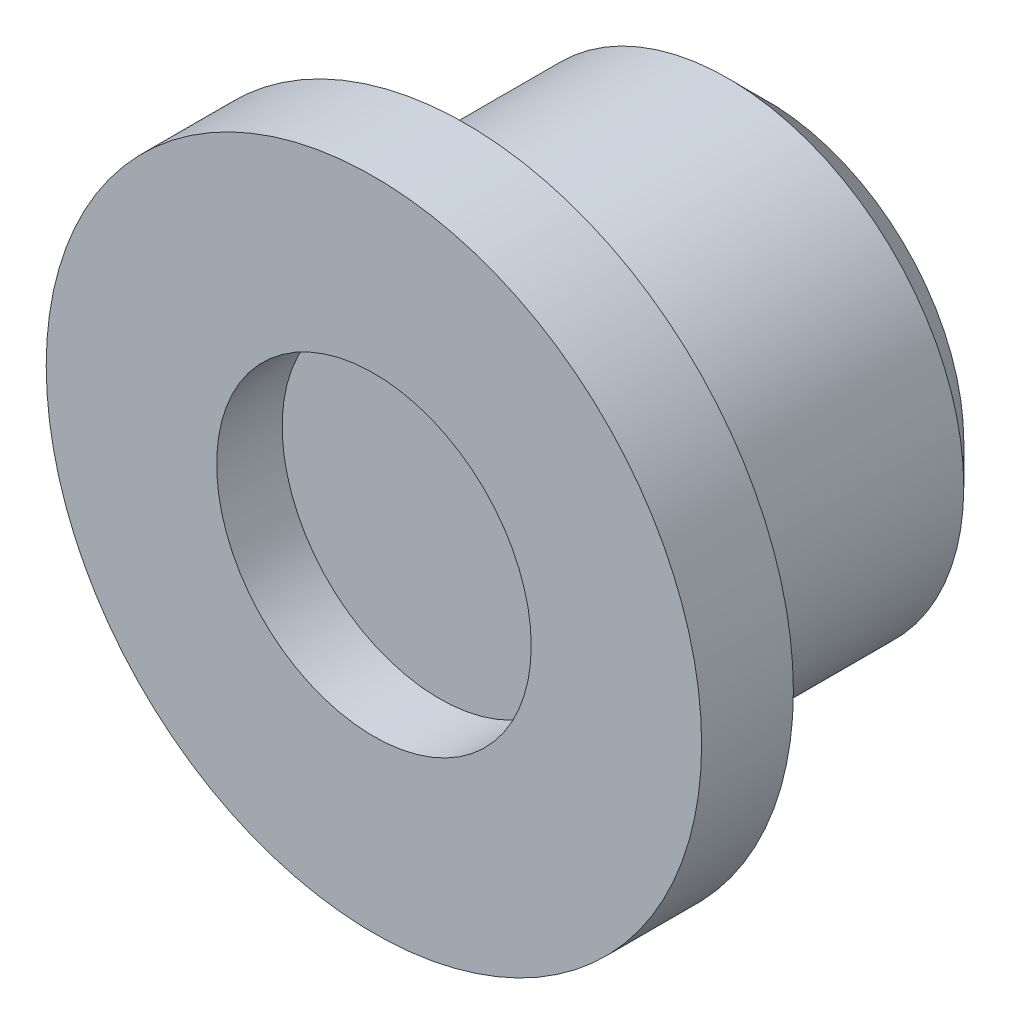
ISO-10303-21;
HEADER;
FILE_DESCRIPTION(('STEP AP214'),'2;1');
FILE_NAME('part.step','',(''),(''),'','','');
FILE_SCHEMA(('AUTOMOTIVE_DESIGN { 1 0 10303 214 1 1 1 1 }'));
ENDSEC;
DATA;
#1=APPLICATION_CONTEXT('core data for automotive mechanical design processes');
#2=APPLICATION_PROTOCOL_DEFINITION('international standard','automotive_design',2000,#1);
#3=PRODUCT_CONTEXT('',#1,'mechanical');
#4=PRODUCT('Part','Part','',(#3));
#5=PRODUCT_RELATED_PRODUCT_CATEGORY('part','',(#4));
#6=PRODUCT_DEFINITION_FORMATION('','',#4);
#7=PRODUCT_DEFINITION_CONTEXT('part definition',#1,'design');
#8=PRODUCT_DEFINITION('design','',#6,#7);
#9=PRODUCT_DEFINITION_SHAPE('','',#8);
#10=(LENGTH_UNIT() NAMED_UNIT(*) SI_UNIT(.MILLI.,.METRE.));
#11=(NAMED_UNIT(*) PLANE_ANGLE_UNIT() SI_UNIT($,.RADIAN.));
#12=(NAMED_UNIT(*) SI_UNIT($,.STERADIAN.) SOLID_ANGLE_UNIT());
#13=UNCERTAINTY_MEASURE_WITH_UNIT(LENGTH_MEASURE(1.E-05),#10,'distance_accuracy_value','');
#14=(GEOMETRIC_REPRESENTATION_CONTEXT(3) GLOBAL_UNCERTAINTY_ASSIGNED_CONTEXT((#13)) GLOBAL_UNIT_ASSIGNED_CONTEXT((#10,
#11,#12)) REPRESENTATION_CONTEXT('',''));
#15=CARTESIAN_POINT('',(0.,0.,0.));
#16=DIRECTION('',(0.,0.,1.));
#17=DIRECTION('',(1.,0.,0.));
#18=AXIS2_PLACEMENT_3D('',#15,#16,#17);
#19=CARTESIAN_POINT('',(0.,0.,3.));
#20=DIRECTION('',(0.,0.,-1.));
#21=DIRECTION('',(-1.,0.,0.));
#22=AXIS2_PLACEMENT_3D('',#19,#20,#21);
#23=CYLINDRICAL_SURFACE('',#22,1.8);
#24=CARTESIAN_POINT('',(0.,0.,0.300000000000001));
#25=DIRECTION('',(0.,0.,1.));
#26=DIRECTION('',(1.,0.,0.));
#27=AXIS2_PLACEMENT_3D('',#24,#25,#26);
#28=CIRCLE('',#27,1.8);
#29=CARTESIAN_POINT('',(1.8,0.,0.300000000000001));
#30=VERTEX_POINT('',#29);
#31=EDGE_CURVE('E44',#30,#30,#28,.T.);
#32=ORIENTED_EDGE('',*,*,#31,.T.);
#33=EDGE_LOOP('',(#32));
#34=FACE_BOUND('',#33,.T.);
#35=CARTESIAN_POINT('',(0.,0.,2.3));
#36=DIRECTION('',(0.,0.,1.));
#37=DIRECTION('',(1.,0.,0.));
#38=AXIS2_PLACEMENT_3D('',#35,#36,#37);
#39=CIRCLE('',#38,1.8);
#40=CARTESIAN_POINT('',(1.8,0.,2.3));
#41=VERTEX_POINT('',#40);
#42=EDGE_CURVE('E49',#41,#41,#39,.T.);
#43=ORIENTED_EDGE('',*,*,#42,.F.);
#44=EDGE_LOOP('',(#43));
#45=FACE_BOUND('',#44,.T.);
#46=ADVANCED_FACE('F36',(#34,#45),#23,.T.);
#47=CARTESIAN_POINT('',(0.,0.,0.));
#48=DIRECTION('',(0.,0.,1.));
#49=DIRECTION('',(1.,0.,0.));
#50=AXIS2_PLACEMENT_3D('',#47,#48,#49);
#51=PLANE('',#50);
#52=CARTESIAN_POINT('',(0.,0.,0.));
#53=DIRECTION('',(0.,0.,1.));
#54=DIRECTION('',(1.,0.,0.));
#55=AXIS2_PLACEMENT_3D('',#52,#53,#54);
#56=CIRCLE('',#55,1.5);
#57=CARTESIAN_POINT('',(1.5,0.,0.));
#58=VERTEX_POINT('',#57);
#59=EDGE_CURVE('E10',#58,#58,#56,.F.);
#60=ORIENTED_EDGE('',*,*,#59,.T.);
#61=EDGE_LOOP('',(#60));
#62=FACE_BOUND('',#61,.T.);
#63=ADVANCED_FACE('F90',(#62),#51,.F.);
#64=CARTESIAN_POINT('',(0.,0.,2.3));
#65=DIRECTION('',(0.,0.,1.));
#66=DIRECTION('',(1.,0.,0.));
#67=AXIS2_PLACEMENT_3D('',#64,#65,#66);
#68=CYLINDRICAL_SURFACE('',#67,2.5);
#69=CARTESIAN_POINT('',(0.,0.,2.3));
#70=DIRECTION('',(0.,0.,1.));
#71=DIRECTION('',(1.,0.,0.));
#72=AXIS2_PLACEMENT_3D('',#69,#70,#71);
#73=CIRCLE('',#72,2.5);
#74=CARTESIAN_POINT('',(2.5,0.,2.3));
#75=VERTEX_POINT('',#74);
#76=EDGE_CURVE('E54',#75,#75,#73,.T.);
#77=ORIENTED_EDGE('',*,*,#76,.T.);
#78=EDGE_LOOP('',(#77));
#79=FACE_BOUND('',#78,.T.);
#80=CARTESIAN_POINT('',(0.,0.,3.));
#81=DIRECTION('',(0.,0.,1.));
#82=DIRECTION('',(1.,0.,0.));
#83=AXIS2_PLACEMENT_3D('',#80,#81,#82);
#84=CIRCLE('',#83,2.5);
#85=CARTESIAN_POINT('',(2.5,0.,3.));
#86=VERTEX_POINT('',#85);
#87=EDGE_CURVE('E57',#86,#86,#84,.T.);
#88=ORIENTED_EDGE('',*,*,#87,.F.);
#89=EDGE_LOOP('',(#88));
#90=FACE_BOUND('',#89,.T.);
#91=ADVANCED_FACE('F88',(#79,#90),#68,.T.);
#92=CARTESIAN_POINT('',(0.,0.,2.3));
#93=DIRECTION('',(0.,0.,1.));
#94=DIRECTION('',(1.,0.,0.));
#95=AXIS2_PLACEMENT_3D('',#92,#93,#94);
#96=PLANE('',#95);
#97=ORIENTED_EDGE('',*,*,#42,.T.);
#98=EDGE_LOOP('',(#97));
#99=FACE_BOUND('',#98,.T.);
#100=ORIENTED_EDGE('',*,*,#76,.F.);
#101=EDGE_LOOP('',(#100));
#102=FACE_BOUND('',#101,.T.);
#103=ADVANCED_FACE('F84',(#99,#102),#96,.F.);
#104=CARTESIAN_POINT('',(0.,0.,3.));
#105=DIRECTION('',(0.,0.,1.));
#106=DIRECTION('',(1.,0.,0.));
#107=AXIS2_PLACEMENT_3D('',#104,#105,#106);
#108=PLANE('',#107);
#109=CARTESIAN_POINT('',(0.,0.,3.));
#110=DIRECTION('',(0.,0.,1.));
#111=DIRECTION('',(1.,0.,0.));
#112=AXIS2_PLACEMENT_3D('',#109,#110,#111);
#113=CIRCLE('',#112,1.2);
#114=CARTESIAN_POINT('',(1.2,0.,3.));
#115=VERTEX_POINT('',#114);
#116=EDGE_CURVE('E65',#115,#115,#113,.T.);
#117=ORIENTED_EDGE('',*,*,#116,.F.);
#118=EDGE_LOOP('',(#117));
#119=FACE_BOUND('',#118,.T.);
#120=ORIENTED_EDGE('',*,*,#87,.T.);
#121=EDGE_LOOP('',(#120));
#122=FACE_BOUND('',#121,.T.);
#123=ADVANCED_FACE('F78',(#119,#122),#108,.T.);
#124=CARTESIAN_POINT('',(0.,0.,2.5));
#125=DIRECTION('',(0.,0.,1.));
#126=DIRECTION('',(1.,0.,0.));
#127=AXIS2_PLACEMENT_3D('',#124,#125,#126);
#128=CYLINDRICAL_SURFACE('',#127,1.2);
#129=CARTESIAN_POINT('',(0.,0.,2.5));
#130=DIRECTION('',(0.,0.,1.));
#131=DIRECTION('',(1.,0.,0.));
#132=AXIS2_PLACEMENT_3D('',#129,#130,#131);
#133=CIRCLE('',#132,1.2);
#134=CARTESIAN_POINT('',(1.2,0.,2.5));
#135=VERTEX_POINT('',#134);
#136=EDGE_CURVE('E61',#135,#135,#133,.T.);
#137=ORIENTED_EDGE('',*,*,#136,.F.);
#138=EDGE_LOOP('',(#137));
#139=FACE_BOUND('',#138,.T.);
#140=ORIENTED_EDGE('',*,*,#116,.T.);
#141=EDGE_LOOP('',(#140));
#142=FACE_BOUND('',#141,.T.);
#143=ADVANCED_FACE('F75',(#139,#142),#128,.F.);
#144=CARTESIAN_POINT('',(0.,0.,2.5));
#145=DIRECTION('',(0.,0.,1.));
#146=DIRECTION('',(1.,0.,0.));
#147=AXIS2_PLACEMENT_3D('',#144,#145,#146);
#148=PLANE('',#147);
#149=ORIENTED_EDGE('',*,*,#136,.T.);
#150=EDGE_LOOP('',(#149));
#151=FACE_BOUND('',#150,.T.);
#152=ADVANCED_FACE('F73',(#151),#148,.T.);
#153=CARTESIAN_POINT('',(0.,0.,0.300000000000001));
#154=DIRECTION('',(0.,0.,1.));
#155=DIRECTION('',(1.,0.,0.));
#156=AXIS2_PLACEMENT_3D('',#153,#154,#155);
#157=CONICAL_SURFACE('',#156,1.8,0.78539816339745);
#158=CARTESIAN_POINT('',(1.5,0.,0.));
#159=CARTESIAN_POINT('',(1.503125,0.,0.00312499999999998));
#160=CARTESIAN_POINT('',(1.50625,0.,0.00624999999999999));
#161=CARTESIAN_POINT('',(1.5125,0.,0.0125));
#162=CARTESIAN_POINT('',(1.515625,0.,0.015625));
#163=CARTESIAN_POINT('',(1.521875,0.,0.021875));
#164=CARTESIAN_POINT('',(1.525,0.,0.025));
#165=CARTESIAN_POINT('',(1.53125,0.,0.03125));
#166=CARTESIAN_POINT('',(1.534375,0.,0.034375));
#167=CARTESIAN_POINT('',(1.540625,0.,0.0406250000000001));
#168=CARTESIAN_POINT('',(1.54375,0.,0.0437500000000001));
#169=CARTESIAN_POINT('',(1.55,0.,0.0500000000000001));
#170=CARTESIAN_POINT('',(1.553125,0.,0.0531250000000001));
#171=CARTESIAN_POINT('',(1.559375,0.,0.0593750000000001));
#172=CARTESIAN_POINT('',(1.5625,0.,0.0625000000000001));
#173=CARTESIAN_POINT('',(1.56875,0.,0.0687500000000001));
#174=CARTESIAN_POINT('',(1.571875,0.,0.0718750000000001));
#175=CARTESIAN_POINT('',(1.578125,0.,0.0781250000000002));
#176=CARTESIAN_POINT('',(1.58125,0.,0.0812500000000002));
#177=CARTESIAN_POINT('',(1.5875,0.,0.0875000000000002));
#178=CARTESIAN_POINT('',(1.590625,0.,0.0906250000000002));
#179=CARTESIAN_POINT('',(1.596875,0.,0.0968750000000002));
#180=CARTESIAN_POINT('',(1.6,0.,0.1));
#181=CARTESIAN_POINT('',(1.60625,0.,0.10625));
#182=CARTESIAN_POINT('',(1.609375,0.,0.109375));
#183=CARTESIAN_POINT('',(1.615625,0.,0.115625));
#184=CARTESIAN_POINT('',(1.61875,0.,0.11875));
#185=CARTESIAN_POINT('',(1.625,0.,0.125));
#186=CARTESIAN_POINT('',(1.628125,0.,0.128125));
#187=CARTESIAN_POINT('',(1.634375,0.,0.134375));
#188=CARTESIAN_POINT('',(1.6375,0.,0.1375));
#189=CARTESIAN_POINT('',(1.64375,0.,0.14375));
#190=CARTESIAN_POINT('',(1.646875,0.,0.146875));
#191=CARTESIAN_POINT('',(1.653125,0.,0.153125));
#192=CARTESIAN_POINT('',(1.65625,0.,0.15625));
#193=CARTESIAN_POINT('',(1.6625,0.,0.1625));
#194=CARTESIAN_POINT('',(1.665625,0.,0.165625));
#195=CARTESIAN_POINT('',(1.671875,0.,0.171875));
#196=CARTESIAN_POINT('',(1.675,0.,0.175));
#197=CARTESIAN_POINT('',(1.68125,0.,0.18125));
#198=CARTESIAN_POINT('',(1.684375,0.,0.184375));
#199=CARTESIAN_POINT('',(1.690625,0.,0.190625));
#200=CARTESIAN_POINT('',(1.69375,0.,0.19375));
#201=CARTESIAN_POINT('',(1.7,0.,0.200000000000001));
#202=CARTESIAN_POINT('',(1.703125,0.,0.203125000000001));
#203=CARTESIAN_POINT('',(1.709375,0.,0.209375000000001));
#204=CARTESIAN_POINT('',(1.7125,0.,0.212500000000001));
#205=CARTESIAN_POINT('',(1.71875,0.,0.218750000000001));
#206=CARTESIAN_POINT('',(1.721875,0.,0.221875000000001));
#207=CARTESIAN_POINT('',(1.728125,0.,0.228125000000001));
#208=CARTESIAN_POINT('',(1.73125,0.,0.231250000000001));
#209=CARTESIAN_POINT('',(1.7375,0.,0.237500000000001));
#210=CARTESIAN_POINT('',(1.740625,0.,0.240625000000001));
#211=CARTESIAN_POINT('',(1.746875,0.,0.246875000000001));
#212=CARTESIAN_POINT('',(1.75,0.,0.250000000000001));
#213=CARTESIAN_POINT('',(1.75625,0.,0.256250000000001));
#214=CARTESIAN_POINT('',(1.759375,0.,0.259375000000001));
#215=CARTESIAN_POINT('',(1.765625,0.,0.265625000000001));
#216=CARTESIAN_POINT('',(1.76875,0.,0.268750000000001));
#217=CARTESIAN_POINT('',(1.775,0.,0.275000000000001));
#218=CARTESIAN_POINT('',(1.778125,0.,0.278125000000001));
#219=CARTESIAN_POINT('',(1.784375,0.,0.284375000000001));
#220=CARTESIAN_POINT('',(1.7875,0.,0.287500000000001));
#221=CARTESIAN_POINT('',(1.79375,0.,0.293750000000001));
#222=CARTESIAN_POINT('',(1.796875,0.,0.296875000000001));
#223=CARTESIAN_POINT('',(1.8,0.,0.300000000000001));
#224=B_SPLINE_CURVE_WITH_KNOTS('',3,(#158,#159,#160,#161,#162,#163,#164,#165,#166,#167,#168,
#169,#170,#171,#172,#173,#174,#175,#176,#177,#178,#179,#180,#181,#182,#183,#184,#185,#186,#187,
#188,#189,#190,#191,#192,#193,#194,#195,#196,#197,#198,#199,#200,#201,#202,#203,#204,#205,#206,
#207,#208,#209,#210,#211,#212,#213,#214,#215,#216,#217,#218,#219,#220,#221,#222,#223),
.UNSPECIFIED.,.F.,.F.,(4,2,2,2,2,2,2,2,2,2,2,2,2,2,2,2,2,2,2,2,2,2,2,2,2,2,2,2,2,2,2,2,4),(0.,
0.0132582521472478,0.0265165042944956,0.0397747564417435,0.0530330085889913,0.0662912607362391,
0.0795495128834869,0.0928077650307347,0.106066017177983,0.11932426932523,0.132582521472478,
0.145840773619726,0.159099025766974,0.172357277914222,0.18561553006147,0.198873782208717,
0.212132034355965,0.225390286503213,0.238648538650461,0.251906790797709,0.265165042944957,
0.278423295092204,0.291681547239452,0.3049397993867,0.318198051533948,0.331456303681196,
0.344714555828444,0.357972807975691,0.371231060122939,0.384489312270187,0.397747564417435,
0.411005816564683,0.424264068711931),.UNSPECIFIED.);
#225=EDGE_CURVE('BSEAM38',#58,#30,#224,.T.);
#226=ORIENTED_EDGE('',*,*,#59,.F.);
#227=ORIENTED_EDGE('',*,*,#31,.F.);
#228=ORIENTED_EDGE('',*,*,#225,.T.);
#229=ORIENTED_EDGE('',*,*,#225,.F.);
#230=EDGE_LOOP('',(#226,#228,#227,#229));
#231=FACE_BOUND('',#230,.T.);
#232=ADVANCED_FACE('F38',(#231),#157,.T.);
#233=CLOSED_SHELL('',(#46,#63,#91,#103,#123,#143,#152,#232));
#234=MANIFOLD_SOLID_BREP('B2',#233);
#235=ADVANCED_BREP_SHAPE_REPRESENTATION('',(#18,#234),#14);
#236=SHAPE_DEFINITION_REPRESENTATION(#9,#235);
ENDSEC;
END-ISO-10303-21;
